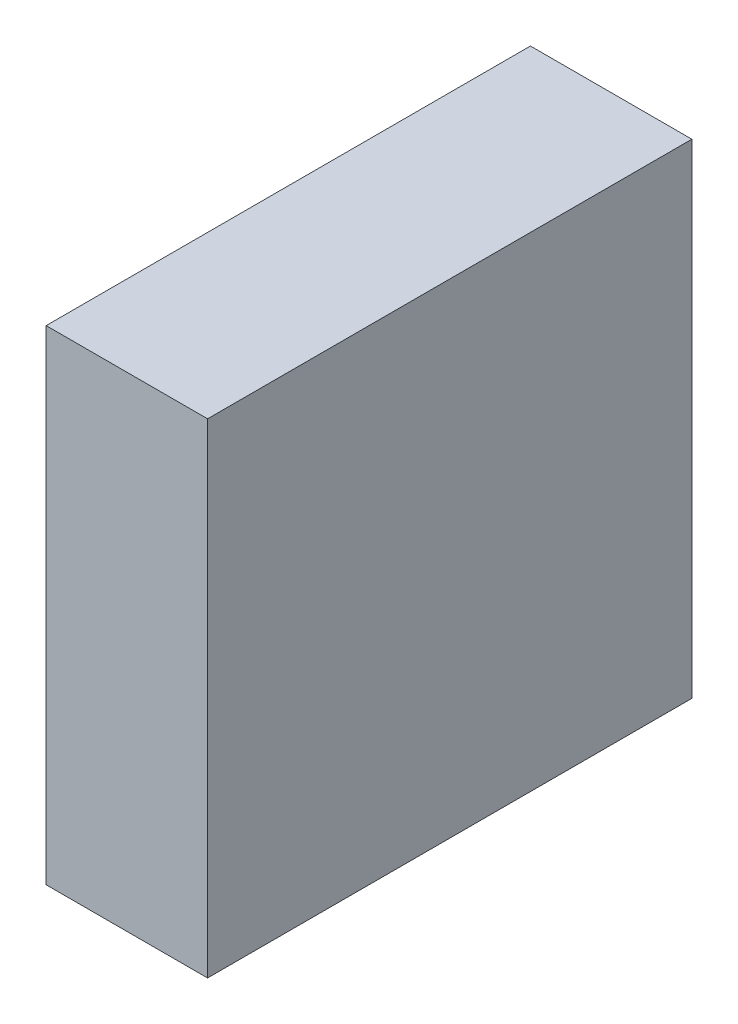
ISO-10303-21;
HEADER;
FILE_DESCRIPTION(('STEP AP214'),'2;1');
FILE_NAME('part.step','',(''),(''),'','','');
FILE_SCHEMA(('AUTOMOTIVE_DESIGN { 1 0 10303 214 1 1 1 1 }'));
ENDSEC;
DATA;
#1=APPLICATION_CONTEXT('core data for automotive mechanical design processes');
#2=APPLICATION_PROTOCOL_DEFINITION('international standard','automotive_design',2000,#1);
#3=PRODUCT_CONTEXT('',#1,'mechanical');
#4=PRODUCT('Part','Part','',(#3));
#5=PRODUCT_RELATED_PRODUCT_CATEGORY('part','',(#4));
#6=PRODUCT_DEFINITION_FORMATION('','',#4);
#7=PRODUCT_DEFINITION_CONTEXT('part definition',#1,'design');
#8=PRODUCT_DEFINITION('design','',#6,#7);
#9=PRODUCT_DEFINITION_SHAPE('','',#8);
#10=(LENGTH_UNIT() NAMED_UNIT(*) SI_UNIT(.MILLI.,.METRE.));
#11=(NAMED_UNIT(*) PLANE_ANGLE_UNIT() SI_UNIT($,.RADIAN.));
#12=(NAMED_UNIT(*) SI_UNIT($,.STERADIAN.) SOLID_ANGLE_UNIT());
#13=UNCERTAINTY_MEASURE_WITH_UNIT(LENGTH_MEASURE(1.E-05),#10,'distance_accuracy_value','');
#14=(GEOMETRIC_REPRESENTATION_CONTEXT(3) GLOBAL_UNCERTAINTY_ASSIGNED_CONTEXT((#13)) GLOBAL_UNIT_ASSIGNED_CONTEXT((#10,
#11,#12)) REPRESENTATION_CONTEXT('',''));
#15=CARTESIAN_POINT('',(0.,0.,0.));
#16=DIRECTION('',(0.,0.,1.));
#17=DIRECTION('',(1.,0.,0.));
#18=AXIS2_PLACEMENT_3D('',#15,#16,#17);
#19=CARTESIAN_POINT('',(10.,-30.,30.));
#20=DIRECTION('',(-1.,0.,0.));
#21=DIRECTION('',(0.,0.,1.));
#22=AXIS2_PLACEMENT_3D('',#19,#20,#21);
#23=PLANE('',#22);
#24=DIRECTION('',(0.,1.,0.));
#25=VECTOR('',#24,1.);
#26=CARTESIAN_POINT('',(10.,-30.,-30.));
#27=LINE('',#26,#25);
#28=CARTESIAN_POINT('',(10.,-30.,-30.));
#29=VERTEX_POINT('',#28);
#30=CARTESIAN_POINT('',(10.,30.,-30.));
#31=VERTEX_POINT('',#30);
#32=EDGE_CURVE('E107',#29,#31,#27,.T.);
#33=ORIENTED_EDGE('',*,*,#32,.T.);
#34=DIRECTION('',(0.,0.,-1.));
#35=VECTOR('',#34,1.);
#36=CARTESIAN_POINT('',(10.,30.,30.));
#37=LINE('',#36,#35);
#38=CARTESIAN_POINT('',(10.,30.,30.));
#39=VERTEX_POINT('',#38);
#40=EDGE_CURVE('E11',#39,#31,#37,.T.);
#41=ORIENTED_EDGE('',*,*,#40,.F.);
#42=DIRECTION('',(0.,1.,0.));
#43=VECTOR('',#42,1.);
#44=CARTESIAN_POINT('',(10.,-30.,30.));
#45=LINE('',#44,#43);
#46=CARTESIAN_POINT('',(10.,-30.,30.));
#47=VERTEX_POINT('',#46);
#48=EDGE_CURVE('E91',#47,#39,#45,.T.);
#49=ORIENTED_EDGE('',*,*,#48,.F.);
#50=DIRECTION('',(0.,0.,-1.));
#51=VECTOR('',#50,1.);
#52=CARTESIAN_POINT('',(10.,-30.,30.));
#53=LINE('',#52,#51);
#54=EDGE_CURVE('E103',#47,#29,#53,.T.);
#55=ORIENTED_EDGE('',*,*,#54,.T.);
#56=EDGE_LOOP('',(#33,#41,#49,#55));
#57=FACE_BOUND('',#56,.T.);
#58=ADVANCED_FACE('F39',(#57),#23,.F.);
#59=CARTESIAN_POINT('',(-10.,30.,30.));
#60=DIRECTION('',(0.,-1.,0.));
#61=DIRECTION('',(0.,0.,-1.));
#62=AXIS2_PLACEMENT_3D('',#59,#60,#61);
#63=PLANE('',#62);
#64=DIRECTION('',(-1.,0.,0.));
#65=VECTOR('',#64,1.);
#66=CARTESIAN_POINT('',(-10.,30.,-30.));
#67=LINE('',#66,#65);
#68=CARTESIAN_POINT('',(-10.,30.,-30.));
#69=VERTEX_POINT('',#68);
#70=EDGE_CURVE('E96',#31,#69,#67,.T.);
#71=ORIENTED_EDGE('',*,*,#70,.T.);
#72=DIRECTION('',(0.,0.,-1.));
#73=VECTOR('',#72,1.);
#74=CARTESIAN_POINT('',(-10.,30.,30.));
#75=LINE('',#74,#73);
#76=CARTESIAN_POINT('',(-10.,30.,30.));
#77=VERTEX_POINT('',#76);
#78=EDGE_CURVE('E48',#77,#69,#75,.T.);
#79=ORIENTED_EDGE('',*,*,#78,.F.);
#80=DIRECTION('',(-1.,0.,0.));
#81=VECTOR('',#80,1.);
#82=CARTESIAN_POINT('',(-10.,30.,30.));
#83=LINE('',#82,#81);
#84=EDGE_CURVE('E86',#39,#77,#83,.T.);
#85=ORIENTED_EDGE('',*,*,#84,.F.);
#86=ORIENTED_EDGE('',*,*,#40,.T.);
#87=EDGE_LOOP('',(#71,#79,#85,#86));
#88=FACE_BOUND('',#87,.T.);
#89=ADVANCED_FACE('F95',(#88),#63,.F.);
#90=CARTESIAN_POINT('',(-10.,-30.,30.));
#91=DIRECTION('',(1.,0.,0.));
#92=DIRECTION('',(0.,0.,-1.));
#93=AXIS2_PLACEMENT_3D('',#90,#91,#92);
#94=PLANE('',#93);
#95=DIRECTION('',(0.,-1.,0.));
#96=VECTOR('',#95,1.);
#97=CARTESIAN_POINT('',(-10.,-30.,-30.));
#98=LINE('',#97,#96);
#99=CARTESIAN_POINT('',(-10.,-30.,-30.));
#100=VERTEX_POINT('',#99);
#101=EDGE_CURVE('E73',#69,#100,#98,.T.);
#102=ORIENTED_EDGE('',*,*,#101,.T.);
#103=DIRECTION('',(0.,0.,-1.));
#104=VECTOR('',#103,1.);
#105=CARTESIAN_POINT('',(-10.,-30.,30.));
#106=LINE('',#105,#104);
#107=CARTESIAN_POINT('',(-10.,-30.,30.));
#108=VERTEX_POINT('',#107);
#109=EDGE_CURVE('E98',#108,#100,#106,.T.);
#110=ORIENTED_EDGE('',*,*,#109,.F.);
#111=DIRECTION('',(0.,-1.,0.));
#112=VECTOR('',#111,1.);
#113=CARTESIAN_POINT('',(-10.,-30.,30.));
#114=LINE('',#113,#112);
#115=EDGE_CURVE('E89',#77,#108,#114,.T.);
#116=ORIENTED_EDGE('',*,*,#115,.F.);
#117=ORIENTED_EDGE('',*,*,#78,.T.);
#118=EDGE_LOOP('',(#102,#110,#116,#117));
#119=FACE_BOUND('',#118,.T.);
#120=ADVANCED_FACE('F99',(#119),#94,.F.);
#121=CARTESIAN_POINT('',(-10.,-30.,30.));
#122=DIRECTION('',(0.,1.,0.));
#123=DIRECTION('',(0.,0.,1.));
#124=AXIS2_PLACEMENT_3D('',#121,#122,#123);
#125=PLANE('',#124);
#126=DIRECTION('',(1.,0.,0.));
#127=VECTOR('',#126,1.);
#128=CARTESIAN_POINT('',(-10.,-30.,-30.));
#129=LINE('',#128,#127);
#130=EDGE_CURVE('E79',#100,#29,#129,.T.);
#131=ORIENTED_EDGE('',*,*,#130,.T.);
#132=ORIENTED_EDGE('',*,*,#54,.F.);
#133=DIRECTION('',(1.,0.,0.));
#134=VECTOR('',#133,1.);
#135=CARTESIAN_POINT('',(-10.,-30.,30.));
#136=LINE('',#135,#134);
#137=EDGE_CURVE('E56',#108,#47,#136,.T.);
#138=ORIENTED_EDGE('',*,*,#137,.F.);
#139=ORIENTED_EDGE('',*,*,#109,.T.);
#140=EDGE_LOOP('',(#131,#132,#138,#139));
#141=FACE_BOUND('',#140,.T.);
#142=ADVANCED_FACE('F120',(#141),#125,.F.);
#143=CARTESIAN_POINT('',(0.,0.,30.));
#144=DIRECTION('',(0.,0.,-1.));
#145=DIRECTION('',(-1.,0.,0.));
#146=AXIS2_PLACEMENT_3D('',#143,#144,#145);
#147=PLANE('',#146);
#148=ORIENTED_EDGE('',*,*,#48,.T.);
#149=ORIENTED_EDGE('',*,*,#84,.T.);
#150=ORIENTED_EDGE('',*,*,#115,.T.);
#151=ORIENTED_EDGE('',*,*,#137,.T.);
#152=EDGE_LOOP('',(#148,#149,#150,#151));
#153=FACE_BOUND('',#152,.T.);
#154=ADVANCED_FACE('F87',(#153),#147,.F.);
#155=CARTESIAN_POINT('',(0.,0.,-30.));
#156=DIRECTION('',(0.,0.,-1.));
#157=DIRECTION('',(-1.,0.,0.));
#158=AXIS2_PLACEMENT_3D('',#155,#156,#157);
#159=PLANE('',#158);
#160=ORIENTED_EDGE('',*,*,#32,.F.);
#161=ORIENTED_EDGE('',*,*,#130,.F.);
#162=ORIENTED_EDGE('',*,*,#101,.F.);
#163=ORIENTED_EDGE('',*,*,#70,.F.);
#164=EDGE_LOOP('',(#160,#161,#162,#163));
#165=FACE_BOUND('',#164,.T.);
#166=ADVANCED_FACE('F123',(#165),#159,.T.);
#167=CLOSED_SHELL('',(#58,#89,#120,#142,#154,#166));
#168=MANIFOLD_SOLID_BREP('B2',#167);
#169=ADVANCED_BREP_SHAPE_REPRESENTATION('',(#18,#168),#14);
#170=SHAPE_DEFINITION_REPRESENTATION(#9,#169);
ENDSEC;
END-ISO-10303-21;
